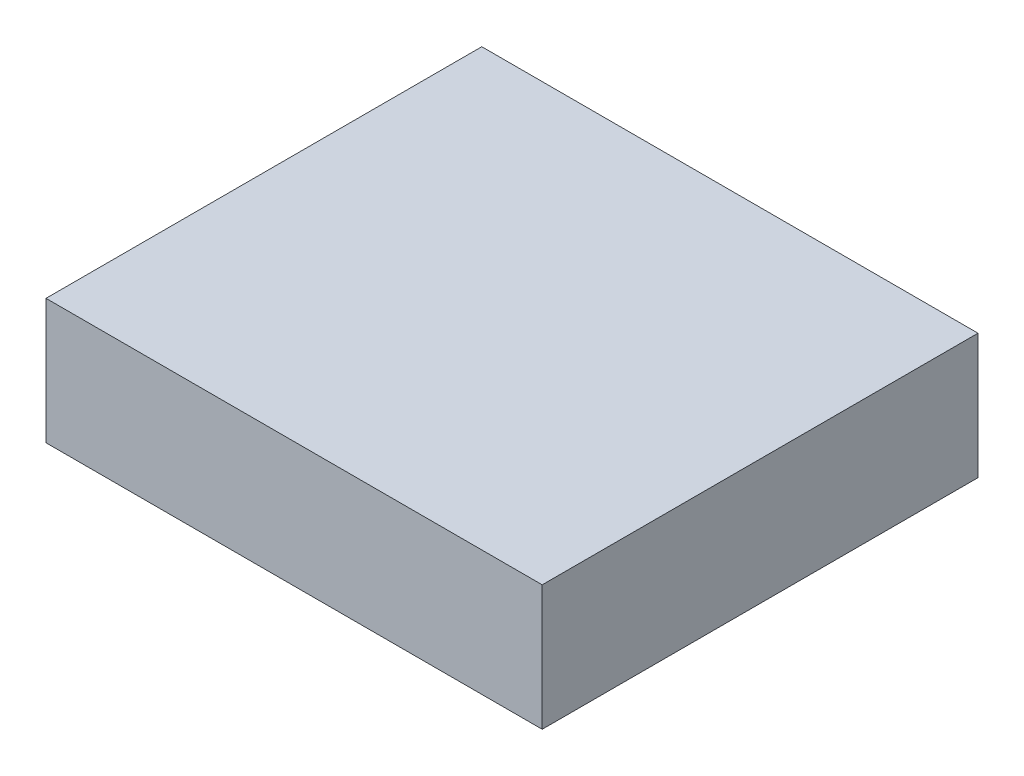
ISO-10303-21;
HEADER;
FILE_DESCRIPTION(('STEP AP214'),'2;1');
FILE_NAME('part.step','',(''),(''),'','','');
FILE_SCHEMA(('AUTOMOTIVE_DESIGN { 1 0 10303 214 1 1 1 1 }'));
ENDSEC;
DATA;
#1=APPLICATION_CONTEXT('core data for automotive mechanical design processes');
#2=APPLICATION_PROTOCOL_DEFINITION('international standard','automotive_design',2000,#1);
#3=PRODUCT_CONTEXT('',#1,'mechanical');
#4=PRODUCT('Part','Part','',(#3));
#5=PRODUCT_RELATED_PRODUCT_CATEGORY('part','',(#4));
#6=PRODUCT_DEFINITION_FORMATION('','',#4);
#7=PRODUCT_DEFINITION_CONTEXT('part definition',#1,'design');
#8=PRODUCT_DEFINITION('design','',#6,#7);
#9=PRODUCT_DEFINITION_SHAPE('','',#8);
#10=(LENGTH_UNIT() NAMED_UNIT(*) SI_UNIT(.MILLI.,.METRE.));
#11=(NAMED_UNIT(*) PLANE_ANGLE_UNIT() SI_UNIT($,.RADIAN.));
#12=(NAMED_UNIT(*) SI_UNIT($,.STERADIAN.) SOLID_ANGLE_UNIT());
#13=UNCERTAINTY_MEASURE_WITH_UNIT(LENGTH_MEASURE(1.E-05),#10,'distance_accuracy_value','');
#14=(GEOMETRIC_REPRESENTATION_CONTEXT(3) GLOBAL_UNCERTAINTY_ASSIGNED_CONTEXT((#13)) GLOBAL_UNIT_ASSIGNED_CONTEXT((#10,
#11,#12)) REPRESENTATION_CONTEXT('',''));
#15=CARTESIAN_POINT('',(0.,0.,0.));
#16=DIRECTION('',(0.,0.,1.));
#17=DIRECTION('',(1.,0.,0.));
#18=AXIS2_PLACEMENT_3D('',#15,#16,#17);
#19=CARTESIAN_POINT('',(57.5,29.,-50.5));
#20=DIRECTION('',(-1.,0.,0.));
#21=DIRECTION('',(0.,0.,1.));
#22=AXIS2_PLACEMENT_3D('',#19,#20,#21);
#23=PLANE('',#22);
#24=DIRECTION('',(0.,0.,-1.));
#25=VECTOR('',#24,1.);
#26=CARTESIAN_POINT('',(57.5,0.,-50.5));
#27=LINE('',#26,#25);
#28=CARTESIAN_POINT('',(57.5,0.,50.5));
#29=VERTEX_POINT('',#28);
#30=CARTESIAN_POINT('',(57.5,0.,-50.5));
#31=VERTEX_POINT('',#30);
#32=EDGE_CURVE('E100',#29,#31,#27,.T.);
#33=ORIENTED_EDGE('',*,*,#32,.T.);
#34=DIRECTION('',(0.,-1.,0.));
#35=VECTOR('',#34,1.);
#36=CARTESIAN_POINT('',(57.5,29.,-50.5));
#37=LINE('',#36,#35);
#38=CARTESIAN_POINT('',(57.5,29.,-50.5));
#39=VERTEX_POINT('',#38);
#40=EDGE_CURVE('E11',#39,#31,#37,.T.);
#41=ORIENTED_EDGE('',*,*,#40,.F.);
#42=DIRECTION('',(0.,0.,-1.));
#43=VECTOR('',#42,1.);
#44=CARTESIAN_POINT('',(57.5,29.,-50.5));
#45=LINE('',#44,#43);
#46=CARTESIAN_POINT('',(57.5,29.,50.5));
#47=VERTEX_POINT('',#46);
#48=EDGE_CURVE('E88',#47,#39,#45,.T.);
#49=ORIENTED_EDGE('',*,*,#48,.F.);
#50=DIRECTION('',(0.,-1.,0.));
#51=VECTOR('',#50,1.);
#52=CARTESIAN_POINT('',(57.5,29.,50.5));
#53=LINE('',#52,#51);
#54=EDGE_CURVE('E96',#47,#29,#53,.T.);
#55=ORIENTED_EDGE('',*,*,#54,.T.);
#56=EDGE_LOOP('',(#33,#41,#49,#55));
#57=FACE_BOUND('',#56,.T.);
#58=ADVANCED_FACE('F37',(#57),#23,.F.);
#59=CARTESIAN_POINT('',(-57.5,29.,-50.5));
#60=DIRECTION('',(0.,0.,1.));
#61=DIRECTION('',(1.,0.,0.));
#62=AXIS2_PLACEMENT_3D('',#59,#60,#61);
#63=PLANE('',#62);
#64=DIRECTION('',(-1.,0.,0.));
#65=VECTOR('',#64,1.);
#66=CARTESIAN_POINT('',(-57.5,0.,-50.5));
#67=LINE('',#66,#65);
#68=CARTESIAN_POINT('',(-57.5,0.,-50.5));
#69=VERTEX_POINT('',#68);
#70=EDGE_CURVE('E92',#31,#69,#67,.T.);
#71=ORIENTED_EDGE('',*,*,#70,.T.);
#72=DIRECTION('',(0.,-1.,0.));
#73=VECTOR('',#72,1.);
#74=CARTESIAN_POINT('',(-57.5,29.,-50.5));
#75=LINE('',#74,#73);
#76=CARTESIAN_POINT('',(-57.5,29.,-50.5));
#77=VERTEX_POINT('',#76);
#78=EDGE_CURVE('E45',#77,#69,#75,.T.);
#79=ORIENTED_EDGE('',*,*,#78,.F.);
#80=DIRECTION('',(-1.,0.,0.));
#81=VECTOR('',#80,1.);
#82=CARTESIAN_POINT('',(-57.5,29.,-50.5));
#83=LINE('',#82,#81);
#84=EDGE_CURVE('E83',#39,#77,#83,.T.);
#85=ORIENTED_EDGE('',*,*,#84,.F.);
#86=ORIENTED_EDGE('',*,*,#40,.T.);
#87=EDGE_LOOP('',(#71,#79,#85,#86));
#88=FACE_BOUND('',#87,.T.);
#89=ADVANCED_FACE('F91',(#88),#63,.F.);
#90=CARTESIAN_POINT('',(-57.5,29.,-50.5));
#91=DIRECTION('',(1.,0.,0.));
#92=DIRECTION('',(0.,0.,-1.));
#93=AXIS2_PLACEMENT_3D('',#90,#91,#92);
#94=PLANE('',#93);
#95=DIRECTION('',(0.,0.,1.));
#96=VECTOR('',#95,1.);
#97=CARTESIAN_POINT('',(-57.5,0.,-50.5));
#98=LINE('',#97,#96);
#99=CARTESIAN_POINT('',(-57.5,0.,50.5));
#100=VERTEX_POINT('',#99);
#101=EDGE_CURVE('E70',#69,#100,#98,.T.);
#102=ORIENTED_EDGE('',*,*,#101,.T.);
#103=DIRECTION('',(0.,-1.,0.));
#104=VECTOR('',#103,1.);
#105=CARTESIAN_POINT('',(-57.5,29.,50.5));
#106=LINE('',#105,#104);
#107=CARTESIAN_POINT('',(-57.5,29.,50.5));
#108=VERTEX_POINT('',#107);
#109=EDGE_CURVE('E93',#108,#100,#106,.T.);
#110=ORIENTED_EDGE('',*,*,#109,.F.);
#111=DIRECTION('',(0.,0.,1.));
#112=VECTOR('',#111,1.);
#113=CARTESIAN_POINT('',(-57.5,29.,-50.5));
#114=LINE('',#113,#112);
#115=EDGE_CURVE('E86',#77,#108,#114,.T.);
#116=ORIENTED_EDGE('',*,*,#115,.F.);
#117=ORIENTED_EDGE('',*,*,#78,.T.);
#118=EDGE_LOOP('',(#102,#110,#116,#117));
#119=FACE_BOUND('',#118,.T.);
#120=ADVANCED_FACE('F94',(#119),#94,.F.);
#121=CARTESIAN_POINT('',(-57.5,29.,50.5));
#122=DIRECTION('',(0.,0.,-1.));
#123=DIRECTION('',(-1.,0.,0.));
#124=AXIS2_PLACEMENT_3D('',#121,#122,#123);
#125=PLANE('',#124);
#126=DIRECTION('',(1.,0.,0.));
#127=VECTOR('',#126,1.);
#128=CARTESIAN_POINT('',(-57.5,0.,50.5));
#129=LINE('',#128,#127);
#130=EDGE_CURVE('E76',#100,#29,#129,.T.);
#131=ORIENTED_EDGE('',*,*,#130,.T.);
#132=ORIENTED_EDGE('',*,*,#54,.F.);
#133=DIRECTION('',(1.,0.,0.));
#134=VECTOR('',#133,1.);
#135=CARTESIAN_POINT('',(-57.5,29.,50.5));
#136=LINE('',#135,#134);
#137=EDGE_CURVE('E53',#108,#47,#136,.T.);
#138=ORIENTED_EDGE('',*,*,#137,.F.);
#139=ORIENTED_EDGE('',*,*,#109,.T.);
#140=EDGE_LOOP('',(#131,#132,#138,#139));
#141=FACE_BOUND('',#140,.T.);
#142=ADVANCED_FACE('F107',(#141),#125,.F.);
#143=CARTESIAN_POINT('',(0.,29.,0.));
#144=DIRECTION('',(0.,1.,0.));
#145=DIRECTION('',(0.,0.,1.));
#146=AXIS2_PLACEMENT_3D('',#143,#144,#145);
#147=PLANE('',#146);
#148=ORIENTED_EDGE('',*,*,#48,.T.);
#149=ORIENTED_EDGE('',*,*,#84,.T.);
#150=ORIENTED_EDGE('',*,*,#115,.T.);
#151=ORIENTED_EDGE('',*,*,#137,.T.);
#152=EDGE_LOOP('',(#148,#149,#150,#151));
#153=FACE_BOUND('',#152,.T.);
#154=ADVANCED_FACE('F84',(#153),#147,.T.);
#155=CARTESIAN_POINT('',(0.,0.,0.));
#156=DIRECTION('',(0.,1.,0.));
#157=DIRECTION('',(0.,0.,1.));
#158=AXIS2_PLACEMENT_3D('',#155,#156,#157);
#159=PLANE('',#158);
#160=ORIENTED_EDGE('',*,*,#32,.F.);
#161=ORIENTED_EDGE('',*,*,#130,.F.);
#162=ORIENTED_EDGE('',*,*,#101,.F.);
#163=ORIENTED_EDGE('',*,*,#70,.F.);
#164=EDGE_LOOP('',(#160,#161,#162,#163));
#165=FACE_BOUND('',#164,.T.);
#166=ADVANCED_FACE('F110',(#165),#159,.F.);
#167=CLOSED_SHELL('',(#58,#89,#120,#142,#154,#166));
#168=MANIFOLD_SOLID_BREP('B2',#167);
#169=ADVANCED_BREP_SHAPE_REPRESENTATION('',(#18,#168),#14);
#170=SHAPE_DEFINITION_REPRESENTATION(#9,#169);
ENDSEC;
END-ISO-10303-21;
